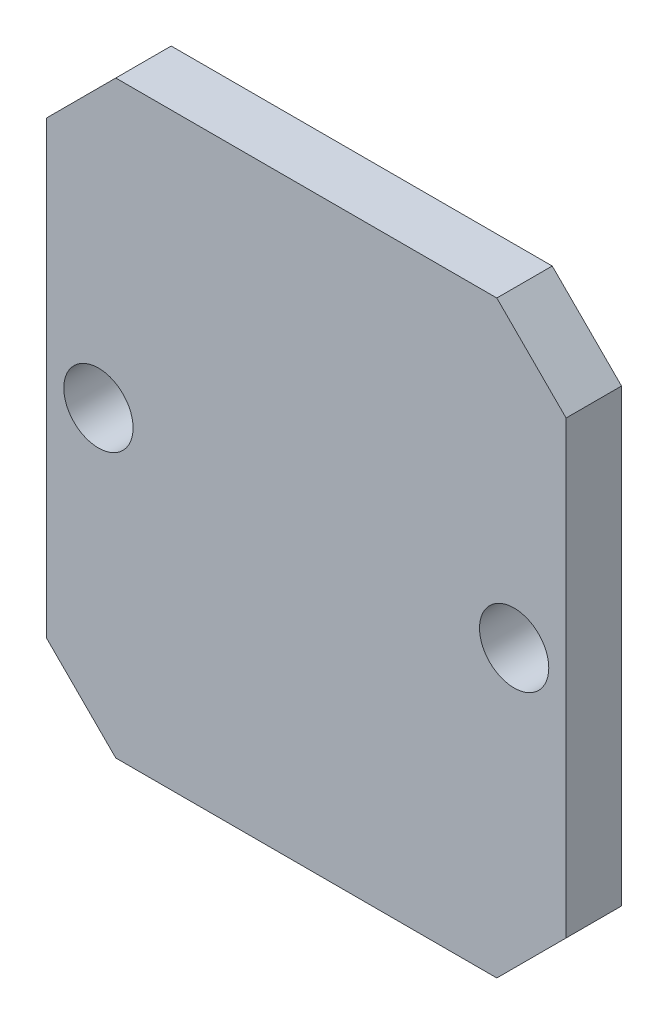
ISO-10303-21;
HEADER;
FILE_DESCRIPTION(('STEP AP214'),'2;1');
FILE_NAME('part.step','',(''),(''),'','','');
FILE_SCHEMA(('AUTOMOTIVE_DESIGN { 1 0 10303 214 1 1 1 1 }'));
ENDSEC;
DATA;
#1=APPLICATION_CONTEXT('core data for automotive mechanical design processes');
#2=APPLICATION_PROTOCOL_DEFINITION('international standard','automotive_design',2000,#1);
#3=PRODUCT_CONTEXT('',#1,'mechanical');
#4=PRODUCT('Part','Part','',(#3));
#5=PRODUCT_RELATED_PRODUCT_CATEGORY('part','',(#4));
#6=PRODUCT_DEFINITION_FORMATION('','',#4);
#7=PRODUCT_DEFINITION_CONTEXT('part definition',#1,'design');
#8=PRODUCT_DEFINITION('design','',#6,#7);
#9=PRODUCT_DEFINITION_SHAPE('','',#8);
#10=(LENGTH_UNIT() NAMED_UNIT(*) SI_UNIT(.MILLI.,.METRE.));
#11=(NAMED_UNIT(*) PLANE_ANGLE_UNIT() SI_UNIT($,.RADIAN.));
#12=(NAMED_UNIT(*) SI_UNIT($,.STERADIAN.) SOLID_ANGLE_UNIT());
#13=UNCERTAINTY_MEASURE_WITH_UNIT(LENGTH_MEASURE(1.E-05),#10,'distance_accuracy_value','');
#14=(GEOMETRIC_REPRESENTATION_CONTEXT(3) GLOBAL_UNCERTAINTY_ASSIGNED_CONTEXT((#13)) GLOBAL_UNIT_ASSIGNED_CONTEXT((#10,
#11,#12)) REPRESENTATION_CONTEXT('',''));
#15=CARTESIAN_POINT('',(0.,0.,0.));
#16=DIRECTION('',(0.,0.,1.));
#17=DIRECTION('',(1.,0.,0.));
#18=AXIS2_PLACEMENT_3D('',#15,#16,#17);
#19=CARTESIAN_POINT('',(0.,0.,1.6));
#20=DIRECTION('',(0.,0.,1.));
#21=DIRECTION('',(1.,0.,0.));
#22=AXIS2_PLACEMENT_3D('',#19,#20,#21);
#23=PLANE('',#22);
#24=CARTESIAN_POINT('',(8.89538951793342,-3.7,1.6));
#25=DIRECTION('',(0.,0.,1.));
#26=DIRECTION('',(1.,0.,0.));
#27=AXIS2_PLACEMENT_3D('',#24,#25,#26);
#28=CIRCLE('',#27,1.);
#29=CARTESIAN_POINT('',(9.89538951793342,-3.7,1.6));
#30=VERTEX_POINT('',#29);
#31=EDGE_CURVE('E130',#30,#30,#28,.T.);
#32=ORIENTED_EDGE('',*,*,#31,.F.);
#33=EDGE_LOOP('',(#32));
#34=FACE_BOUND('',#33,.T.);
#35=DIRECTION('',(0.,-1.,0.));
#36=VECTOR('',#35,1.);
#37=CARTESIAN_POINT('',(-4.60461048206658,4.8,1.6));
#38=LINE('',#37,#36);
#39=CARTESIAN_POINT('',(-4.60461048206658,2.8,1.6));
#40=VERTEX_POINT('',#39);
#41=CARTESIAN_POINT('',(-4.60461048206658,-10.2,1.6));
#42=VERTEX_POINT('',#41);
#43=EDGE_CURVE('E135',#40,#42,#38,.T.);
#44=ORIENTED_EDGE('',*,*,#43,.T.);
#45=DIRECTION('',(-0.707106781186546,0.707106781186549,0.));
#46=VECTOR('',#45,1.);
#47=CARTESIAN_POINT('',(-7.4023052410333,-7.40230524103327,1.6));
#48=LINE('',#47,#46);
#49=CARTESIAN_POINT('',(-2.60461048206658,-12.2,1.6));
#50=VERTEX_POINT('',#49);
#51=EDGE_CURVE('E150',#42,#50,#48,.F.);
#52=ORIENTED_EDGE('',*,*,#51,.T.);
#53=DIRECTION('',(1.,0.,0.));
#54=VECTOR('',#53,1.);
#55=CARTESIAN_POINT('',(-4.60461048206658,-12.2,1.6));
#56=LINE('',#55,#54);
#57=CARTESIAN_POINT('',(8.39538951793341,-12.2,1.6));
#58=VERTEX_POINT('',#57);
#59=EDGE_CURVE('E117',#50,#58,#56,.T.);
#60=ORIENTED_EDGE('',*,*,#59,.T.);
#61=DIRECTION('',(-0.707106781186549,-0.707106781186546,0.));
#62=VECTOR('',#61,1.);
#63=CARTESIAN_POINT('',(10.2976947589667,-10.2976947589667,1.6));
#64=LINE('',#63,#62);
#65=CARTESIAN_POINT('',(10.3953895179334,-10.2,1.6));
#66=VERTEX_POINT('',#65);
#67=EDGE_CURVE('E148',#58,#66,#64,.F.);
#68=ORIENTED_EDGE('',*,*,#67,.T.);
#69=DIRECTION('',(0.,1.,0.));
#70=VECTOR('',#69,1.);
#71=CARTESIAN_POINT('',(10.3953895179334,4.8,1.6));
#72=LINE('',#71,#70);
#73=CARTESIAN_POINT('',(10.3953895179334,2.79999999999999,1.6));
#74=VERTEX_POINT('',#73);
#75=EDGE_CURVE('E170',#66,#74,#72,.T.);
#76=ORIENTED_EDGE('',*,*,#75,.T.);
#77=DIRECTION('',(0.707106781186546,-0.707106781186549,0.));
#78=VECTOR('',#77,1.);
#79=CARTESIAN_POINT('',(6.59769475896672,6.5976947589667,1.6));
#80=LINE('',#79,#78);
#81=CARTESIAN_POINT('',(8.39538951793342,4.8,1.6));
#82=VERTEX_POINT('',#81);
#83=EDGE_CURVE('E52',#74,#82,#80,.F.);
#84=ORIENTED_EDGE('',*,*,#83,.T.);
#85=DIRECTION('',(-1.,0.,0.));
#86=VECTOR('',#85,1.);
#87=CARTESIAN_POINT('',(-4.60461048206658,4.8,1.6));
#88=LINE('',#87,#86);
#89=CARTESIAN_POINT('',(-2.60461048206658,4.8,1.6));
#90=VERTEX_POINT('',#89);
#91=EDGE_CURVE('E136',#82,#90,#88,.T.);
#92=ORIENTED_EDGE('',*,*,#91,.T.);
#93=DIRECTION('',(0.707106781186549,0.707106781186546,0.));
#94=VECTOR('',#93,1.);
#95=CARTESIAN_POINT('',(-3.70230524103328,3.7023052410333,1.6));
#96=LINE('',#95,#94);
#97=EDGE_CURVE('E146',#90,#40,#96,.F.);
#98=ORIENTED_EDGE('',*,*,#97,.T.);
#99=EDGE_LOOP('',(#44,#52,#60,#68,#76,#84,#92,#98));
#100=FACE_BOUND('',#99,.T.);
#101=CARTESIAN_POINT('',(-3.10461048206658,-3.7,1.6));
#102=DIRECTION('',(0.,0.,1.));
#103=DIRECTION('',(1.,0.,0.));
#104=AXIS2_PLACEMENT_3D('',#101,#102,#103);
#105=CIRCLE('',#104,1.);
#106=CARTESIAN_POINT('',(-2.10461048206658,-3.7,1.6));
#107=VERTEX_POINT('',#106);
#108=EDGE_CURVE('E182',#107,#107,#105,.T.);
#109=ORIENTED_EDGE('',*,*,#108,.F.);
#110=EDGE_LOOP('',(#109));
#111=FACE_BOUND('',#110,.T.);
#112=ADVANCED_FACE('F32',(#34,#100,#111),#23,.T.);
#113=CARTESIAN_POINT('',(0.,0.,0.));
#114=DIRECTION('',(0.,0.,1.));
#115=DIRECTION('',(1.,0.,0.));
#116=AXIS2_PLACEMENT_3D('',#113,#114,#115);
#117=PLANE('',#116);
#118=DIRECTION('',(1.,0.,0.));
#119=VECTOR('',#118,1.);
#120=CARTESIAN_POINT('',(-4.60461048206658,-12.2,0.));
#121=LINE('',#120,#119);
#122=CARTESIAN_POINT('',(-2.60461048206658,-12.2,0.));
#123=VERTEX_POINT('',#122);
#124=CARTESIAN_POINT('',(8.39538951793341,-12.2,0.));
#125=VERTEX_POINT('',#124);
#126=EDGE_CURVE('E114',#123,#125,#121,.T.);
#127=ORIENTED_EDGE('',*,*,#126,.F.);
#128=DIRECTION('',(0.707106781186546,-0.707106781186549,0.));
#129=VECTOR('',#128,1.);
#130=CARTESIAN_POINT('',(-2.60461048206658,-12.2,0.));
#131=LINE('',#130,#129);
#132=CARTESIAN_POINT('',(-4.60461048206658,-10.2,0.));
#133=VERTEX_POINT('',#132);
#134=EDGE_CURVE('E97',#123,#133,#131,.F.);
#135=ORIENTED_EDGE('',*,*,#134,.T.);
#136=DIRECTION('',(0.,-1.,0.));
#137=VECTOR('',#136,1.);
#138=CARTESIAN_POINT('',(-4.60461048206658,4.8,0.));
#139=LINE('',#138,#137);
#140=CARTESIAN_POINT('',(-4.60461048206658,2.8,0.));
#141=VERTEX_POINT('',#140);
#142=EDGE_CURVE('E125',#141,#133,#139,.T.);
#143=ORIENTED_EDGE('',*,*,#142,.F.);
#144=DIRECTION('',(-0.707106781186549,-0.707106781186546,0.));
#145=VECTOR('',#144,1.);
#146=CARTESIAN_POINT('',(-4.60461048206658,2.8,0.));
#147=LINE('',#146,#145);
#148=CARTESIAN_POINT('',(-2.60461048206658,4.8,0.));
#149=VERTEX_POINT('',#148);
#150=EDGE_CURVE('E139',#141,#149,#147,.F.);
#151=ORIENTED_EDGE('',*,*,#150,.T.);
#152=DIRECTION('',(-1.,0.,0.));
#153=VECTOR('',#152,1.);
#154=CARTESIAN_POINT('',(-4.60461048206658,4.8,0.));
#155=LINE('',#154,#153);
#156=CARTESIAN_POINT('',(8.39538951793342,4.8,0.));
#157=VERTEX_POINT('',#156);
#158=EDGE_CURVE('E128',#157,#149,#155,.T.);
#159=ORIENTED_EDGE('',*,*,#158,.F.);
#160=DIRECTION('',(-0.707106781186546,0.707106781186549,0.));
#161=VECTOR('',#160,1.);
#162=CARTESIAN_POINT('',(8.39538951793342,4.8,0.));
#163=LINE('',#162,#161);
#164=CARTESIAN_POINT('',(10.3953895179334,2.79999999999999,0.));
#165=VERTEX_POINT('',#164);
#166=EDGE_CURVE('E118',#157,#165,#163,.F.);
#167=ORIENTED_EDGE('',*,*,#166,.T.);
#168=DIRECTION('',(0.,1.,0.));
#169=VECTOR('',#168,1.);
#170=CARTESIAN_POINT('',(10.3953895179334,4.8,0.));
#171=LINE('',#170,#169);
#172=CARTESIAN_POINT('',(10.3953895179334,-10.2,0.));
#173=VERTEX_POINT('',#172);
#174=EDGE_CURVE('E124',#173,#165,#171,.T.);
#175=ORIENTED_EDGE('',*,*,#174,.F.);
#176=DIRECTION('',(0.707106781186549,0.707106781186546,0.));
#177=VECTOR('',#176,1.);
#178=CARTESIAN_POINT('',(10.3953895179334,-10.2,0.));
#179=LINE('',#178,#177);
#180=EDGE_CURVE('E108',#173,#125,#179,.F.);
#181=ORIENTED_EDGE('',*,*,#180,.T.);
#182=EDGE_LOOP('',(#127,#135,#143,#151,#159,#167,#175,#181));
#183=FACE_BOUND('',#182,.T.);
#184=CARTESIAN_POINT('',(8.89538951793342,-3.7,0.));
#185=DIRECTION('',(0.,0.,1.));
#186=DIRECTION('',(1.,0.,0.));
#187=AXIS2_PLACEMENT_3D('',#184,#185,#186);
#188=CIRCLE('',#187,1.);
#189=CARTESIAN_POINT('',(9.89538951793342,-3.7,0.));
#190=VERTEX_POINT('',#189);
#191=EDGE_CURVE('E173',#190,#190,#188,.T.);
#192=ORIENTED_EDGE('',*,*,#191,.T.);
#193=EDGE_LOOP('',(#192));
#194=FACE_BOUND('',#193,.T.);
#195=CARTESIAN_POINT('',(-3.10461048206658,-3.7,0.));
#196=DIRECTION('',(0.,0.,1.));
#197=DIRECTION('',(1.,0.,0.));
#198=AXIS2_PLACEMENT_3D('',#195,#196,#197);
#199=CIRCLE('',#198,1.);
#200=CARTESIAN_POINT('',(-2.10461048206658,-3.7,0.));
#201=VERTEX_POINT('',#200);
#202=EDGE_CURVE('E184',#201,#201,#199,.T.);
#203=ORIENTED_EDGE('',*,*,#202,.T.);
#204=EDGE_LOOP('',(#203));
#205=FACE_BOUND('',#204,.T.);
#206=ADVANCED_FACE('F121',(#183,#194,#205),#117,.F.);
#207=CARTESIAN_POINT('',(-4.60461048206658,4.8,1.6));
#208=DIRECTION('',(1.,0.,0.));
#209=DIRECTION('',(0.,1.,0.));
#210=AXIS2_PLACEMENT_3D('',#207,#208,#209);
#211=PLANE('',#210);
#212=ORIENTED_EDGE('',*,*,#142,.T.);
#213=DIRECTION('',(0.,0.,1.));
#214=VECTOR('',#213,1.);
#215=CARTESIAN_POINT('',(-4.60461048206658,-10.2,1.6));
#216=LINE('',#215,#214);
#217=EDGE_CURVE('E102',#133,#42,#216,.T.);
#218=ORIENTED_EDGE('',*,*,#217,.T.);
#219=ORIENTED_EDGE('',*,*,#43,.F.);
#220=DIRECTION('',(0.,0.,-1.));
#221=VECTOR('',#220,1.);
#222=CARTESIAN_POINT('',(-4.60461048206658,2.8,1.6));
#223=LINE('',#222,#221);
#224=EDGE_CURVE('E107',#40,#141,#223,.T.);
#225=ORIENTED_EDGE('',*,*,#224,.T.);
#226=EDGE_LOOP('',(#212,#218,#219,#225));
#227=FACE_BOUND('',#226,.T.);
#228=ADVANCED_FACE('F167',(#227),#211,.F.);
#229=CARTESIAN_POINT('',(-4.60461048206658,-12.2,1.6));
#230=DIRECTION('',(0.,1.,0.));
#231=DIRECTION('',(0.,0.,1.));
#232=AXIS2_PLACEMENT_3D('',#229,#230,#231);
#233=PLANE('',#232);
#234=ORIENTED_EDGE('',*,*,#59,.F.);
#235=DIRECTION('',(0.,0.,-1.));
#236=VECTOR('',#235,1.);
#237=CARTESIAN_POINT('',(-2.60461048206658,-12.2,1.6));
#238=LINE('',#237,#236);
#239=EDGE_CURVE('E101',#50,#123,#238,.T.);
#240=ORIENTED_EDGE('',*,*,#239,.T.);
#241=ORIENTED_EDGE('',*,*,#126,.T.);
#242=DIRECTION('',(0.,0.,1.));
#243=VECTOR('',#242,1.);
#244=CARTESIAN_POINT('',(8.39538951793342,-12.2,1.6));
#245=LINE('',#244,#243);
#246=EDGE_CURVE('E119',#125,#58,#245,.T.);
#247=ORIENTED_EDGE('',*,*,#246,.T.);
#248=EDGE_LOOP('',(#234,#240,#241,#247));
#249=FACE_BOUND('',#248,.T.);
#250=ADVANCED_FACE('F113',(#249),#233,.F.);
#251=CARTESIAN_POINT('',(10.3953895179334,4.8,1.6));
#252=DIRECTION('',(-1.,0.,0.));
#253=DIRECTION('',(0.,-1.,0.));
#254=AXIS2_PLACEMENT_3D('',#251,#252,#253);
#255=PLANE('',#254);
#256=ORIENTED_EDGE('',*,*,#75,.F.);
#257=DIRECTION('',(0.,0.,-1.));
#258=VECTOR('',#257,1.);
#259=CARTESIAN_POINT('',(10.3953895179334,-10.2,1.6));
#260=LINE('',#259,#258);
#261=EDGE_CURVE('E154',#66,#173,#260,.T.);
#262=ORIENTED_EDGE('',*,*,#261,.T.);
#263=ORIENTED_EDGE('',*,*,#174,.T.);
#264=DIRECTION('',(0.,0.,1.));
#265=VECTOR('',#264,1.);
#266=CARTESIAN_POINT('',(10.3953895179334,2.79999999999999,1.6));
#267=LINE('',#266,#265);
#268=EDGE_CURVE('E152',#165,#74,#267,.T.);
#269=ORIENTED_EDGE('',*,*,#268,.T.);
#270=EDGE_LOOP('',(#256,#262,#263,#269));
#271=FACE_BOUND('',#270,.T.);
#272=ADVANCED_FACE('F213',(#271),#255,.F.);
#273=CARTESIAN_POINT('',(-4.60461048206658,4.8,1.6));
#274=DIRECTION('',(0.,-1.,0.));
#275=DIRECTION('',(0.,0.,-1.));
#276=AXIS2_PLACEMENT_3D('',#273,#274,#275);
#277=PLANE('',#276);
#278=ORIENTED_EDGE('',*,*,#158,.T.);
#279=DIRECTION('',(0.,0.,1.));
#280=VECTOR('',#279,1.);
#281=CARTESIAN_POINT('',(-2.60461048206658,4.8,1.6));
#282=LINE('',#281,#280);
#283=EDGE_CURVE('E11',#149,#90,#282,.T.);
#284=ORIENTED_EDGE('',*,*,#283,.T.);
#285=ORIENTED_EDGE('',*,*,#91,.F.);
#286=DIRECTION('',(0.,0.,-1.));
#287=VECTOR('',#286,1.);
#288=CARTESIAN_POINT('',(8.39538951793342,4.8,1.6));
#289=LINE('',#288,#287);
#290=EDGE_CURVE('E40',#82,#157,#289,.T.);
#291=ORIENTED_EDGE('',*,*,#290,.T.);
#292=EDGE_LOOP('',(#278,#284,#285,#291));
#293=FACE_BOUND('',#292,.T.);
#294=ADVANCED_FACE('F159',(#293),#277,.F.);
#295=CARTESIAN_POINT('',(8.89538951793342,-3.7,1.6));
#296=DIRECTION('',(0.,0.,-1.));
#297=DIRECTION('',(-1.,0.,0.));
#298=AXIS2_PLACEMENT_3D('',#295,#296,#297);
#299=CYLINDRICAL_SURFACE('',#298,1.);
#300=ORIENTED_EDGE('',*,*,#31,.T.);
#301=EDGE_LOOP('',(#300));
#302=FACE_BOUND('',#301,.T.);
#303=ORIENTED_EDGE('',*,*,#191,.F.);
#304=EDGE_LOOP('',(#303));
#305=FACE_BOUND('',#304,.T.);
#306=ADVANCED_FACE('F192',(#302,#305),#299,.F.);
#307=CARTESIAN_POINT('',(-3.10461048206658,-3.7,1.6));
#308=DIRECTION('',(0.,0.,-1.));
#309=DIRECTION('',(-1.,0.,0.));
#310=AXIS2_PLACEMENT_3D('',#307,#308,#309);
#311=CYLINDRICAL_SURFACE('',#310,1.);
#312=ORIENTED_EDGE('',*,*,#108,.T.);
#313=EDGE_LOOP('',(#312));
#314=FACE_BOUND('',#313,.T.);
#315=ORIENTED_EDGE('',*,*,#202,.F.);
#316=EDGE_LOOP('',(#315));
#317=FACE_BOUND('',#316,.T.);
#318=ADVANCED_FACE('F195',(#314,#317),#311,.F.);
#319=CARTESIAN_POINT('',(-2.60461048206658,-12.2,1.6));
#320=DIRECTION('',(0.707106781186549,0.707106781186546,0.));
#321=DIRECTION('',(0.,0.,-1.));
#322=AXIS2_PLACEMENT_3D('',#319,#320,#321);
#323=PLANE('',#322);
#324=ORIENTED_EDGE('',*,*,#51,.F.);
#325=ORIENTED_EDGE('',*,*,#217,.F.);
#326=ORIENTED_EDGE('',*,*,#134,.F.);
#327=ORIENTED_EDGE('',*,*,#239,.F.);
#328=EDGE_LOOP('',(#324,#325,#326,#327));
#329=FACE_BOUND('',#328,.T.);
#330=ADVANCED_FACE('F100',(#329),#323,.F.);
#331=CARTESIAN_POINT('',(10.3953895179334,-10.2,1.6));
#332=DIRECTION('',(-0.707106781186546,0.707106781186549,0.));
#333=DIRECTION('',(0.,0.,-1.));
#334=AXIS2_PLACEMENT_3D('',#331,#332,#333);
#335=PLANE('',#334);
#336=ORIENTED_EDGE('',*,*,#67,.F.);
#337=ORIENTED_EDGE('',*,*,#246,.F.);
#338=ORIENTED_EDGE('',*,*,#180,.F.);
#339=ORIENTED_EDGE('',*,*,#261,.F.);
#340=EDGE_LOOP('',(#336,#337,#338,#339));
#341=FACE_BOUND('',#340,.T.);
#342=ADVANCED_FACE('F208',(#341),#335,.F.);
#343=CARTESIAN_POINT('',(-4.60461048206658,2.8,1.6));
#344=DIRECTION('',(0.707106781186546,-0.707106781186549,0.));
#345=DIRECTION('',(0.,0.,-1.));
#346=AXIS2_PLACEMENT_3D('',#343,#344,#345);
#347=PLANE('',#346);
#348=ORIENTED_EDGE('',*,*,#97,.F.);
#349=ORIENTED_EDGE('',*,*,#283,.F.);
#350=ORIENTED_EDGE('',*,*,#150,.F.);
#351=ORIENTED_EDGE('',*,*,#224,.F.);
#352=EDGE_LOOP('',(#348,#349,#350,#351));
#353=FACE_BOUND('',#352,.T.);
#354=ADVANCED_FACE('F164',(#353),#347,.F.);
#355=CARTESIAN_POINT('',(8.39538951793342,4.8,1.6));
#356=DIRECTION('',(-0.707106781186549,-0.707106781186546,0.));
#357=DIRECTION('',(0.,0.,-1.));
#358=AXIS2_PLACEMENT_3D('',#355,#356,#357);
#359=PLANE('',#358);
#360=ORIENTED_EDGE('',*,*,#83,.F.);
#361=ORIENTED_EDGE('',*,*,#268,.F.);
#362=ORIENTED_EDGE('',*,*,#166,.F.);
#363=ORIENTED_EDGE('',*,*,#290,.F.);
#364=EDGE_LOOP('',(#360,#361,#362,#363));
#365=FACE_BOUND('',#364,.T.);
#366=ADVANCED_FACE('F34',(#365),#359,.F.);
#367=CLOSED_SHELL('',(#112,#206,#228,#250,#272,#294,#306,#318,#330,#342,#354,#366));
#368=MANIFOLD_SOLID_BREP('B2',#367);
#369=ADVANCED_BREP_SHAPE_REPRESENTATION('',(#18,#368),#14);
#370=SHAPE_DEFINITION_REPRESENTATION(#9,#369);
ENDSEC;
END-ISO-10303-21;
